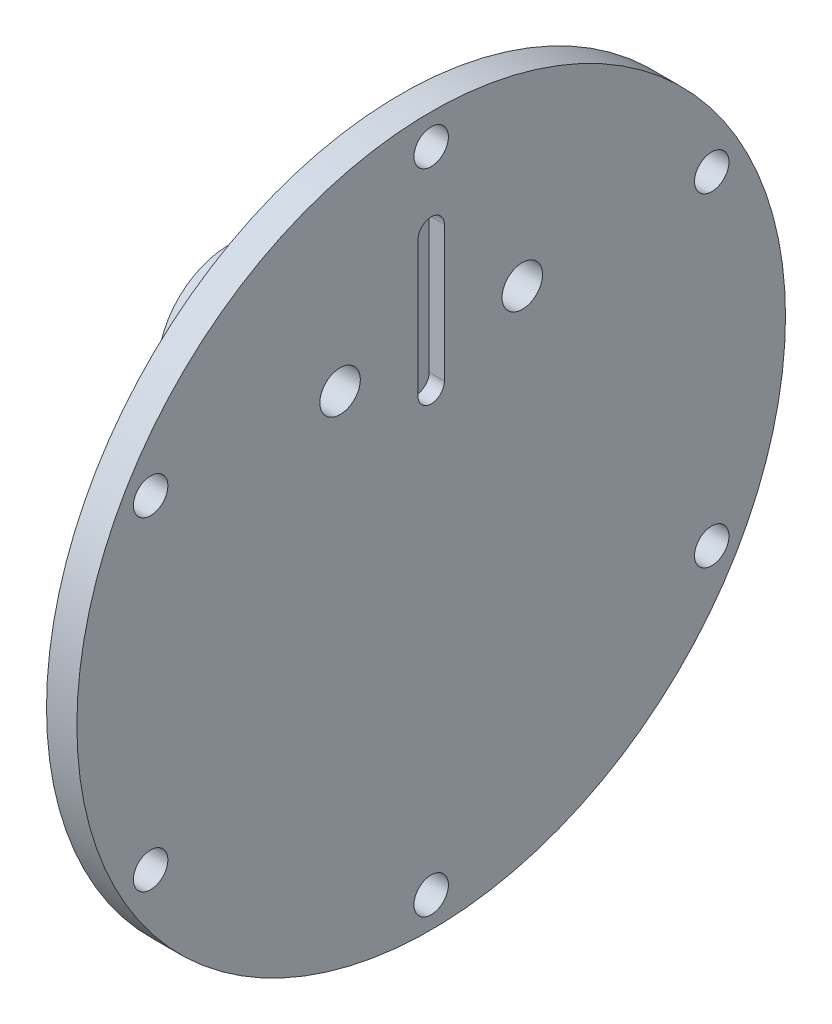
ISO-10303-21;
HEADER;
FILE_DESCRIPTION(('STEP AP214'),'2;1');
FILE_NAME('part.step','',(''),(''),'','','');
FILE_SCHEMA(('AUTOMOTIVE_DESIGN { 1 0 10303 214 1 1 1 1 }'));
ENDSEC;
DATA;
#1=APPLICATION_CONTEXT('core data for automotive mechanical design processes');
#2=APPLICATION_PROTOCOL_DEFINITION('international standard','automotive_design',2000,#1);
#3=PRODUCT_CONTEXT('',#1,'mechanical');
#4=PRODUCT('Part','Part','',(#3));
#5=PRODUCT_RELATED_PRODUCT_CATEGORY('part','',(#4));
#6=PRODUCT_DEFINITION_FORMATION('','',#4);
#7=PRODUCT_DEFINITION_CONTEXT('part definition',#1,'design');
#8=PRODUCT_DEFINITION('design','',#6,#7);
#9=PRODUCT_DEFINITION_SHAPE('','',#8);
#10=(LENGTH_UNIT() NAMED_UNIT(*) SI_UNIT(.MILLI.,.METRE.));
#11=(NAMED_UNIT(*) PLANE_ANGLE_UNIT() SI_UNIT($,.RADIAN.));
#12=(NAMED_UNIT(*) SI_UNIT($,.STERADIAN.) SOLID_ANGLE_UNIT());
#13=UNCERTAINTY_MEASURE_WITH_UNIT(LENGTH_MEASURE(1.E-05),#10,'distance_accuracy_value','');
#14=(GEOMETRIC_REPRESENTATION_CONTEXT(3) GLOBAL_UNCERTAINTY_ASSIGNED_CONTEXT((#13)) GLOBAL_UNIT_ASSIGNED_CONTEXT((#10,
#11,#12)) REPRESENTATION_CONTEXT('',''));
#15=CARTESIAN_POINT('',(0.,0.,0.));
#16=DIRECTION('',(0.,0.,1.));
#17=DIRECTION('',(1.,0.,0.));
#18=AXIS2_PLACEMENT_3D('',#15,#16,#17);
#19=CARTESIAN_POINT('',(0.,0.,0.));
#20=DIRECTION('',(-1.,0.,0.));
#21=DIRECTION('',(0.,0.,1.));
#22=AXIS2_PLACEMENT_3D('',#19,#20,#21);
#23=PLANE('',#22);
#24=CARTESIAN_POINT('',(0.,0.,0.));
#25=DIRECTION('',(-1.,0.,0.));
#26=DIRECTION('',(0.,0.,1.));
#27=AXIS2_PLACEMENT_3D('',#24,#25,#26);
#28=CIRCLE('',#27,35.);
#29=CARTESIAN_POINT('',(0.,0.,35.));
#30=VERTEX_POINT('',#29);
#31=EDGE_CURVE('E176',#30,#30,#28,.T.);
#32=ORIENTED_EDGE('',*,*,#31,.F.);
#33=EDGE_LOOP('',(#32));
#34=FACE_BOUND('',#33,.T.);
#35=CARTESIAN_POINT('',(0.,16.,27.712812921102));
#36=DIRECTION('',(1.,0.,0.));
#37=DIRECTION('',(0.,0.,-1.));
#38=AXIS2_PLACEMENT_3D('',#35,#36,#37);
#39=CIRCLE('',#38,1.7);
#40=CARTESIAN_POINT('',(0.,16.,26.012812921102));
#41=VERTEX_POINT('',#40);
#42=EDGE_CURVE('E139',#41,#41,#39,.T.);
#43=ORIENTED_EDGE('',*,*,#42,.F.);
#44=EDGE_LOOP('',(#43));
#45=FACE_BOUND('',#44,.T.);
#46=CARTESIAN_POINT('',(0.,-16.,27.712812921102));
#47=DIRECTION('',(1.,0.,0.));
#48=DIRECTION('',(0.,0.,-1.));
#49=AXIS2_PLACEMENT_3D('',#46,#47,#48);
#50=CIRCLE('',#49,1.7);
#51=CARTESIAN_POINT('',(0.,-16.,26.012812921102));
#52=VERTEX_POINT('',#51);
#53=EDGE_CURVE('E151',#52,#52,#50,.T.);
#54=ORIENTED_EDGE('',*,*,#53,.F.);
#55=EDGE_LOOP('',(#54));
#56=FACE_BOUND('',#55,.T.);
#57=CARTESIAN_POINT('',(0.,-32.,0.));
#58=DIRECTION('',(1.,0.,0.));
#59=DIRECTION('',(0.,0.,-1.));
#60=AXIS2_PLACEMENT_3D('',#57,#58,#59);
#61=CIRCLE('',#60,1.7);
#62=CARTESIAN_POINT('',(0.,-32.,-1.7));
#63=VERTEX_POINT('',#62);
#64=EDGE_CURVE('E157',#63,#63,#61,.T.);
#65=ORIENTED_EDGE('',*,*,#64,.F.);
#66=EDGE_LOOP('',(#65));
#67=FACE_BOUND('',#66,.T.);
#68=CARTESIAN_POINT('',(0.,-16.,-27.712812921102));
#69=DIRECTION('',(1.,0.,0.));
#70=DIRECTION('',(0.,0.,-1.));
#71=AXIS2_PLACEMENT_3D('',#68,#69,#70);
#72=CIRCLE('',#71,1.7);
#73=CARTESIAN_POINT('',(0.,-16.,-29.412812921102));
#74=VERTEX_POINT('',#73);
#75=EDGE_CURVE('E163',#74,#74,#72,.T.);
#76=ORIENTED_EDGE('',*,*,#75,.F.);
#77=EDGE_LOOP('',(#76));
#78=FACE_BOUND('',#77,.T.);
#79=CARTESIAN_POINT('',(0.,16.,-27.712812921102));
#80=DIRECTION('',(1.,0.,0.));
#81=DIRECTION('',(0.,0.,-1.));
#82=AXIS2_PLACEMENT_3D('',#79,#80,#81);
#83=CIRCLE('',#82,1.7);
#84=CARTESIAN_POINT('',(0.,16.,-29.412812921102));
#85=VERTEX_POINT('',#84);
#86=EDGE_CURVE('E140',#85,#85,#83,.T.);
#87=ORIENTED_EDGE('',*,*,#86,.F.);
#88=EDGE_LOOP('',(#87));
#89=FACE_BOUND('',#88,.T.);
#90=CARTESIAN_POINT('',(0.,32.,0.));
#91=DIRECTION('',(1.,0.,0.));
#92=DIRECTION('',(0.,0.,-1.));
#93=AXIS2_PLACEMENT_3D('',#90,#91,#92);
#94=CIRCLE('',#93,1.7);
#95=CARTESIAN_POINT('',(0.,32.,-1.7));
#96=VERTEX_POINT('',#95);
#97=EDGE_CURVE('E132',#96,#96,#94,.T.);
#98=ORIENTED_EDGE('',*,*,#97,.F.);
#99=EDGE_LOOP('',(#98));
#100=FACE_BOUND('',#99,.T.);
#101=CARTESIAN_POINT('',(0.,15.5884572681199,-9.));
#102=DIRECTION('',(1.,0.,0.));
#103=DIRECTION('',(0.,0.,-1.));
#104=AXIS2_PLACEMENT_3D('',#101,#102,#103);
#105=CIRCLE('',#104,2.);
#106=CARTESIAN_POINT('',(0.,15.5884572681199,-11.));
#107=VERTEX_POINT('',#106);
#108=EDGE_CURVE('E95',#107,#107,#105,.T.);
#109=ORIENTED_EDGE('',*,*,#108,.F.);
#110=EDGE_LOOP('',(#109));
#111=FACE_BOUND('',#110,.T.);
#112=CARTESIAN_POINT('',(0.,15.5884572681199,9.));
#113=DIRECTION('',(1.,0.,0.));
#114=DIRECTION('',(0.,0.,-1.));
#115=AXIS2_PLACEMENT_3D('',#112,#113,#114);
#116=CIRCLE('',#115,2.);
#117=CARTESIAN_POINT('',(0.,15.5884572681199,7.));
#118=VERTEX_POINT('',#117);
#119=EDGE_CURVE('E113',#118,#118,#116,.T.);
#120=ORIENTED_EDGE('',*,*,#119,.F.);
#121=EDGE_LOOP('',(#120));
#122=FACE_BOUND('',#121,.T.);
#123=CARTESIAN_POINT('',(0.,11.3,0.));
#124=DIRECTION('',(1.,0.,0.));
#125=DIRECTION('',(0.,0.,-1.));
#126=AXIS2_PLACEMENT_3D('',#123,#124,#125);
#127=CIRCLE('',#126,1.3);
#128=CARTESIAN_POINT('',(0.,11.3,1.3));
#129=VERTEX_POINT('',#128);
#130=CARTESIAN_POINT('',(0.,11.3,-1.3));
#131=VERTEX_POINT('',#130);
#132=EDGE_CURVE('E80',#129,#131,#127,.T.);
#133=ORIENTED_EDGE('',*,*,#132,.F.);
#134=DIRECTION('',(0.,-1.,0.));
#135=VECTOR('',#134,1.);
#136=CARTESIAN_POINT('',(0.,24.7,1.3));
#137=LINE('',#136,#135);
#138=CARTESIAN_POINT('',(0.,24.7,1.3));
#139=VERTEX_POINT('',#138);
#140=EDGE_CURVE('E56',#139,#129,#137,.T.);
#141=ORIENTED_EDGE('',*,*,#140,.F.);
#142=CARTESIAN_POINT('',(0.,24.7,0.));
#143=DIRECTION('',(1.,0.,0.));
#144=DIRECTION('',(0.,0.,-1.));
#145=AXIS2_PLACEMENT_3D('',#142,#143,#144);
#146=CIRCLE('',#145,1.3);
#147=CARTESIAN_POINT('',(0.,24.7,-1.3));
#148=VERTEX_POINT('',#147);
#149=EDGE_CURVE('E99',#148,#139,#146,.T.);
#150=ORIENTED_EDGE('',*,*,#149,.F.);
#151=DIRECTION('',(0.,1.,0.));
#152=VECTOR('',#151,1.);
#153=CARTESIAN_POINT('',(0.,11.3,-1.3));
#154=LINE('',#153,#152);
#155=EDGE_CURVE('E88',#131,#148,#154,.T.);
#156=ORIENTED_EDGE('',*,*,#155,.F.);
#157=EDGE_LOOP('',(#133,#141,#150,#156));
#158=FACE_BOUND('',#157,.T.);
#159=ADVANCED_FACE('F33',(#34,#45,#56,#67,#78,#89,#100,#111,#122,#158),#23,.F.);
#160=CARTESIAN_POINT('',(-3.,35.,0.));
#161=DIRECTION('',(1.,0.,0.));
#162=DIRECTION('',(0.,0.,-1.));
#163=AXIS2_PLACEMENT_3D('',#160,#161,#162);
#164=PLANE('',#163);
#165=CARTESIAN_POINT('',(-3.,32.,0.));
#166=DIRECTION('',(1.,0.,0.));
#167=DIRECTION('',(0.,0.,-1.));
#168=AXIS2_PLACEMENT_3D('',#165,#166,#167);
#169=CIRCLE('',#168,1.7);
#170=CARTESIAN_POINT('',(-3.,32.,-1.7));
#171=VERTEX_POINT('',#170);
#172=EDGE_CURVE('E136',#171,#171,#169,.T.);
#173=ORIENTED_EDGE('',*,*,#172,.T.);
#174=EDGE_LOOP('',(#173));
#175=FACE_BOUND('',#174,.T.);
#176=CARTESIAN_POINT('',(-3.,16.,-27.712812921102));
#177=DIRECTION('',(1.,0.,0.));
#178=DIRECTION('',(0.,0.,-1.));
#179=AXIS2_PLACEMENT_3D('',#176,#177,#178);
#180=CIRCLE('',#179,1.7);
#181=CARTESIAN_POINT('',(-3.,16.,-29.412812921102));
#182=VERTEX_POINT('',#181);
#183=EDGE_CURVE('E122',#182,#182,#180,.T.);
#184=ORIENTED_EDGE('',*,*,#183,.T.);
#185=EDGE_LOOP('',(#184));
#186=FACE_BOUND('',#185,.T.);
#187=CARTESIAN_POINT('',(-3.,-16.,-27.712812921102));
#188=DIRECTION('',(1.,0.,0.));
#189=DIRECTION('',(0.,0.,-1.));
#190=AXIS2_PLACEMENT_3D('',#187,#188,#189);
#191=CIRCLE('',#190,1.7);
#192=CARTESIAN_POINT('',(-3.,-16.,-29.412812921102));
#193=VERTEX_POINT('',#192);
#194=EDGE_CURVE('E143',#193,#193,#191,.T.);
#195=ORIENTED_EDGE('',*,*,#194,.T.);
#196=EDGE_LOOP('',(#195));
#197=FACE_BOUND('',#196,.T.);
#198=CARTESIAN_POINT('',(-3.,-32.,0.));
#199=DIRECTION('',(1.,0.,0.));
#200=DIRECTION('',(0.,0.,-1.));
#201=AXIS2_PLACEMENT_3D('',#198,#199,#200);
#202=CIRCLE('',#201,1.7);
#203=CARTESIAN_POINT('',(-3.,-32.,-1.7));
#204=VERTEX_POINT('',#203);
#205=EDGE_CURVE('E160',#204,#204,#202,.T.);
#206=ORIENTED_EDGE('',*,*,#205,.T.);
#207=EDGE_LOOP('',(#206));
#208=FACE_BOUND('',#207,.T.);
#209=CARTESIAN_POINT('',(-3.,-16.,27.712812921102));
#210=DIRECTION('',(1.,0.,0.));
#211=DIRECTION('',(0.,0.,-1.));
#212=AXIS2_PLACEMENT_3D('',#209,#210,#211);
#213=CIRCLE('',#212,1.7);
#214=CARTESIAN_POINT('',(-3.,-16.,26.012812921102));
#215=VERTEX_POINT('',#214);
#216=EDGE_CURVE('E154',#215,#215,#213,.T.);
#217=ORIENTED_EDGE('',*,*,#216,.T.);
#218=EDGE_LOOP('',(#217));
#219=FACE_BOUND('',#218,.T.);
#220=CARTESIAN_POINT('',(-3.,16.,27.712812921102));
#221=DIRECTION('',(1.,0.,0.));
#222=DIRECTION('',(0.,0.,-1.));
#223=AXIS2_PLACEMENT_3D('',#220,#221,#222);
#224=CIRCLE('',#223,1.7);
#225=CARTESIAN_POINT('',(-3.,16.,26.012812921102));
#226=VERTEX_POINT('',#225);
#227=EDGE_CURVE('E148',#226,#226,#224,.T.);
#228=ORIENTED_EDGE('',*,*,#227,.T.);
#229=EDGE_LOOP('',(#228));
#230=FACE_BOUND('',#229,.T.);
#231=CARTESIAN_POINT('',(-3.,15.5884572681199,-9.));
#232=DIRECTION('',(1.,0.,0.));
#233=DIRECTION('',(0.,0.,-1.));
#234=AXIS2_PLACEMENT_3D('',#231,#232,#233);
#235=CIRCLE('',#234,7.);
#236=CARTESIAN_POINT('',(-3.,15.5884572681199,-16.));
#237=VERTEX_POINT('',#236);
#238=EDGE_CURVE('E11',#237,#237,#235,.F.);
#239=ORIENTED_EDGE('',*,*,#238,.F.);
#240=EDGE_LOOP('',(#239));
#241=FACE_BOUND('',#240,.T.);
#242=CARTESIAN_POINT('',(-3.,15.5884572681199,9.));
#243=DIRECTION('',(1.,0.,0.));
#244=DIRECTION('',(0.,0.,-1.));
#245=AXIS2_PLACEMENT_3D('',#242,#243,#244);
#246=CIRCLE('',#245,7.);
#247=CARTESIAN_POINT('',(-3.,15.5884572681199,2.));
#248=VERTEX_POINT('',#247);
#249=EDGE_CURVE('E42',#248,#248,#246,.F.);
#250=ORIENTED_EDGE('',*,*,#249,.F.);
#251=EDGE_LOOP('',(#250));
#252=FACE_BOUND('',#251,.T.);
#253=CARTESIAN_POINT('',(-3.,0.,0.));
#254=DIRECTION('',(-1.,0.,0.));
#255=DIRECTION('',(0.,0.,1.));
#256=AXIS2_PLACEMENT_3D('',#253,#254,#255);
#257=CIRCLE('',#256,35.);
#258=CARTESIAN_POINT('',(-3.,0.,35.));
#259=VERTEX_POINT('',#258);
#260=EDGE_CURVE('E173',#259,#259,#257,.T.);
#261=ORIENTED_EDGE('',*,*,#260,.T.);
#262=EDGE_LOOP('',(#261));
#263=FACE_BOUND('',#262,.T.);
#264=ADVANCED_FACE('F35',(#175,#186,#197,#208,#219,#230,#241,#252,#263),#164,.F.);
#265=CARTESIAN_POINT('',(-30.,0.,0.));
#266=DIRECTION('',(-1.,0.,0.));
#267=DIRECTION('',(0.,0.,1.));
#268=AXIS2_PLACEMENT_3D('',#265,#266,#267);
#269=CYLINDRICAL_SURFACE('',#268,35.);
#270=ORIENTED_EDGE('',*,*,#260,.F.);
#271=EDGE_LOOP('',(#270));
#272=FACE_BOUND('',#271,.T.);
#273=ORIENTED_EDGE('',*,*,#31,.T.);
#274=EDGE_LOOP('',(#273));
#275=FACE_BOUND('',#274,.T.);
#276=ADVANCED_FACE('F225',(#272,#275),#269,.T.);
#277=CARTESIAN_POINT('',(-3.,15.5884572681199,9.));
#278=DIRECTION('',(-1.,0.,0.));
#279=DIRECTION('',(0.,0.,1.));
#280=AXIS2_PLACEMENT_3D('',#277,#278,#279);
#281=CYLINDRICAL_SURFACE('',#280,7.);
#282=ORIENTED_EDGE('',*,*,#249,.T.);
#283=EDGE_LOOP('',(#282));
#284=FACE_BOUND('',#283,.T.);
#285=CARTESIAN_POINT('',(-11.,15.5884572681199,9.));
#286=DIRECTION('',(1.,0.,0.));
#287=DIRECTION('',(0.,0.,-1.));
#288=AXIS2_PLACEMENT_3D('',#285,#286,#287);
#289=CIRCLE('',#288,7.);
#290=CARTESIAN_POINT('',(-11.,15.5884572681199,2.));
#291=VERTEX_POINT('',#290);
#292=EDGE_CURVE('E170',#291,#291,#289,.T.);
#293=ORIENTED_EDGE('',*,*,#292,.T.);
#294=EDGE_LOOP('',(#293));
#295=FACE_BOUND('',#294,.T.);
#296=ADVANCED_FACE('F217',(#284,#295),#281,.T.);
#297=CARTESIAN_POINT('',(-11.,15.5884572681199,9.));
#298=DIRECTION('',(1.,0.,0.));
#299=DIRECTION('',(0.,0.,-1.));
#300=AXIS2_PLACEMENT_3D('',#297,#298,#299);
#301=PLANE('',#300);
#302=CARTESIAN_POINT('',(-11.,15.5884572681199,9.));
#303=DIRECTION('',(1.,0.,0.));
#304=DIRECTION('',(0.,0.,-1.));
#305=AXIS2_PLACEMENT_3D('',#302,#303,#304);
#306=CIRCLE('',#305,4.4);
#307=CARTESIAN_POINT('',(-11.,15.5884572681199,4.6));
#308=VERTEX_POINT('',#307);
#309=EDGE_CURVE('E123',#308,#308,#306,.T.);
#310=ORIENTED_EDGE('',*,*,#309,.T.);
#311=EDGE_LOOP('',(#310));
#312=FACE_BOUND('',#311,.T.);
#313=ORIENTED_EDGE('',*,*,#292,.F.);
#314=EDGE_LOOP('',(#313));
#315=FACE_BOUND('',#314,.T.);
#316=ADVANCED_FACE('F211',(#312,#315),#301,.F.);
#317=CARTESIAN_POINT('',(-3.,15.5884572681199,-9.));
#318=DIRECTION('',(-1.,0.,0.));
#319=DIRECTION('',(0.,0.,1.));
#320=AXIS2_PLACEMENT_3D('',#317,#318,#319);
#321=CYLINDRICAL_SURFACE('',#320,7.);
#322=ORIENTED_EDGE('',*,*,#238,.T.);
#323=EDGE_LOOP('',(#322));
#324=FACE_BOUND('',#323,.T.);
#325=CARTESIAN_POINT('',(-11.,15.5884572681199,-9.));
#326=DIRECTION('',(1.,0.,0.));
#327=DIRECTION('',(0.,0.,-1.));
#328=AXIS2_PLACEMENT_3D('',#325,#326,#327);
#329=CIRCLE('',#328,7.);
#330=CARTESIAN_POINT('',(-11.,15.5884572681199,-16.));
#331=VERTEX_POINT('',#330);
#332=EDGE_CURVE('E135',#331,#331,#329,.T.);
#333=ORIENTED_EDGE('',*,*,#332,.T.);
#334=EDGE_LOOP('',(#333));
#335=FACE_BOUND('',#334,.T.);
#336=ADVANCED_FACE('F206',(#324,#335),#321,.T.);
#337=CARTESIAN_POINT('',(-11.,15.5884572681199,-9.));
#338=DIRECTION('',(1.,0.,0.));
#339=DIRECTION('',(0.,0.,-1.));
#340=AXIS2_PLACEMENT_3D('',#337,#338,#339);
#341=PLANE('',#340);
#342=CARTESIAN_POINT('',(-11.,15.5884572681199,-9.));
#343=DIRECTION('',(1.,0.,0.));
#344=DIRECTION('',(0.,0.,-1.));
#345=AXIS2_PLACEMENT_3D('',#342,#343,#344);
#346=CIRCLE('',#345,4.4);
#347=CARTESIAN_POINT('',(-11.,15.5884572681199,-13.4));
#348=VERTEX_POINT('',#347);
#349=EDGE_CURVE('E129',#348,#348,#346,.T.);
#350=ORIENTED_EDGE('',*,*,#349,.T.);
#351=EDGE_LOOP('',(#350));
#352=FACE_BOUND('',#351,.T.);
#353=ORIENTED_EDGE('',*,*,#332,.F.);
#354=EDGE_LOOP('',(#353));
#355=FACE_BOUND('',#354,.T.);
#356=ADVANCED_FACE('F202',(#352,#355),#341,.F.);
#357=CARTESIAN_POINT('',(0.,16.,27.712812921102));
#358=DIRECTION('',(-1.,0.,0.));
#359=DIRECTION('',(0.,0.,1.));
#360=AXIS2_PLACEMENT_3D('',#357,#358,#359);
#361=CYLINDRICAL_SURFACE('',#360,1.7);
#362=ORIENTED_EDGE('',*,*,#42,.T.);
#363=EDGE_LOOP('',(#362));
#364=FACE_BOUND('',#363,.T.);
#365=ORIENTED_EDGE('',*,*,#227,.F.);
#366=EDGE_LOOP('',(#365));
#367=FACE_BOUND('',#366,.T.);
#368=ADVANCED_FACE('F205',(#364,#367),#361,.F.);
#369=CARTESIAN_POINT('',(0.,-16.,27.712812921102));
#370=DIRECTION('',(-1.,0.,0.));
#371=DIRECTION('',(0.,0.,1.));
#372=AXIS2_PLACEMENT_3D('',#369,#370,#371);
#373=CYLINDRICAL_SURFACE('',#372,1.7);
#374=ORIENTED_EDGE('',*,*,#53,.T.);
#375=EDGE_LOOP('',(#374));
#376=FACE_BOUND('',#375,.T.);
#377=ORIENTED_EDGE('',*,*,#216,.F.);
#378=EDGE_LOOP('',(#377));
#379=FACE_BOUND('',#378,.T.);
#380=ADVANCED_FACE('F376',(#376,#379),#373,.F.);
#381=CARTESIAN_POINT('',(0.,-32.,0.));
#382=DIRECTION('',(-1.,0.,0.));
#383=DIRECTION('',(0.,0.,1.));
#384=AXIS2_PLACEMENT_3D('',#381,#382,#383);
#385=CYLINDRICAL_SURFACE('',#384,1.7);
#386=ORIENTED_EDGE('',*,*,#64,.T.);
#387=EDGE_LOOP('',(#386));
#388=FACE_BOUND('',#387,.T.);
#389=ORIENTED_EDGE('',*,*,#205,.F.);
#390=EDGE_LOOP('',(#389));
#391=FACE_BOUND('',#390,.T.);
#392=ADVANCED_FACE('F380',(#388,#391),#385,.F.);
#393=CARTESIAN_POINT('',(0.,-16.,-27.712812921102));
#394=DIRECTION('',(-1.,0.,0.));
#395=DIRECTION('',(0.,0.,1.));
#396=AXIS2_PLACEMENT_3D('',#393,#394,#395);
#397=CYLINDRICAL_SURFACE('',#396,1.7);
#398=ORIENTED_EDGE('',*,*,#75,.T.);
#399=EDGE_LOOP('',(#398));
#400=FACE_BOUND('',#399,.T.);
#401=ORIENTED_EDGE('',*,*,#194,.F.);
#402=EDGE_LOOP('',(#401));
#403=FACE_BOUND('',#402,.T.);
#404=ADVANCED_FACE('F373',(#400,#403),#397,.F.);
#405=CARTESIAN_POINT('',(0.,16.,-27.712812921102));
#406=DIRECTION('',(-1.,0.,0.));
#407=DIRECTION('',(0.,0.,1.));
#408=AXIS2_PLACEMENT_3D('',#405,#406,#407);
#409=CYLINDRICAL_SURFACE('',#408,1.7);
#410=ORIENTED_EDGE('',*,*,#86,.T.);
#411=EDGE_LOOP('',(#410));
#412=FACE_BOUND('',#411,.T.);
#413=ORIENTED_EDGE('',*,*,#183,.F.);
#414=EDGE_LOOP('',(#413));
#415=FACE_BOUND('',#414,.T.);
#416=ADVANCED_FACE('F369',(#412,#415),#409,.F.);
#417=CARTESIAN_POINT('',(0.,32.,0.));
#418=DIRECTION('',(-1.,0.,0.));
#419=DIRECTION('',(0.,0.,1.));
#420=AXIS2_PLACEMENT_3D('',#417,#418,#419);
#421=CYLINDRICAL_SURFACE('',#420,1.7);
#422=ORIENTED_EDGE('',*,*,#97,.T.);
#423=EDGE_LOOP('',(#422));
#424=FACE_BOUND('',#423,.T.);
#425=ORIENTED_EDGE('',*,*,#172,.F.);
#426=EDGE_LOOP('',(#425));
#427=FACE_BOUND('',#426,.T.);
#428=ADVANCED_FACE('F198',(#424,#427),#421,.F.);
#429=CARTESIAN_POINT('',(-4.,15.5884572681199,-9.));
#430=DIRECTION('',(-1.,0.,0.));
#431=DIRECTION('',(0.,0.,1.));
#432=AXIS2_PLACEMENT_3D('',#429,#430,#431);
#433=CYLINDRICAL_SURFACE('',#432,4.4);
#434=CARTESIAN_POINT('',(-4.,15.5884572681199,-9.));
#435=DIRECTION('',(1.,0.,0.));
#436=DIRECTION('',(0.,0.,-1.));
#437=AXIS2_PLACEMENT_3D('',#434,#435,#436);
#438=CIRCLE('',#437,4.4);
#439=CARTESIAN_POINT('',(-4.,15.5884572681199,-13.4));
#440=VERTEX_POINT('',#439);
#441=EDGE_CURVE('E126',#440,#440,#438,.T.);
#442=ORIENTED_EDGE('',*,*,#441,.T.);
#443=EDGE_LOOP('',(#442));
#444=FACE_BOUND('',#443,.T.);
#445=ORIENTED_EDGE('',*,*,#349,.F.);
#446=EDGE_LOOP('',(#445));
#447=FACE_BOUND('',#446,.T.);
#448=ADVANCED_FACE('F192',(#444,#447),#433,.F.);
#449=CARTESIAN_POINT('',(-4.,15.5884572681199,-9.));
#450=DIRECTION('',(1.,0.,0.));
#451=DIRECTION('',(0.,0.,-1.));
#452=AXIS2_PLACEMENT_3D('',#449,#450,#451);
#453=PLANE('',#452);
#454=CARTESIAN_POINT('',(-4.,15.5884572681199,-9.));
#455=DIRECTION('',(1.,0.,0.));
#456=DIRECTION('',(0.,0.,-1.));
#457=AXIS2_PLACEMENT_3D('',#454,#455,#456);
#458=CIRCLE('',#457,2.);
#459=CARTESIAN_POINT('',(-4.,15.5884572681199,-11.));
#460=VERTEX_POINT('',#459);
#461=EDGE_CURVE('E37',#460,#460,#458,.F.);
#462=ORIENTED_EDGE('',*,*,#461,.F.);
#463=EDGE_LOOP('',(#462));
#464=FACE_BOUND('',#463,.T.);
#465=ORIENTED_EDGE('',*,*,#441,.F.);
#466=EDGE_LOOP('',(#465));
#467=FACE_BOUND('',#466,.T.);
#468=ADVANCED_FACE('F188',(#464,#467),#453,.F.);
#469=CARTESIAN_POINT('',(-4.,15.5884572681199,9.));
#470=DIRECTION('',(-1.,0.,0.));
#471=DIRECTION('',(0.,0.,1.));
#472=AXIS2_PLACEMENT_3D('',#469,#470,#471);
#473=CYLINDRICAL_SURFACE('',#472,4.4);
#474=CARTESIAN_POINT('',(-4.,15.5884572681199,9.));
#475=DIRECTION('',(1.,0.,0.));
#476=DIRECTION('',(0.,0.,-1.));
#477=AXIS2_PLACEMENT_3D('',#474,#475,#476);
#478=CIRCLE('',#477,4.4);
#479=CARTESIAN_POINT('',(-4.,15.5884572681199,4.6));
#480=VERTEX_POINT('',#479);
#481=EDGE_CURVE('E119',#480,#480,#478,.T.);
#482=ORIENTED_EDGE('',*,*,#481,.T.);
#483=EDGE_LOOP('',(#482));
#484=FACE_BOUND('',#483,.T.);
#485=ORIENTED_EDGE('',*,*,#309,.F.);
#486=EDGE_LOOP('',(#485));
#487=FACE_BOUND('',#486,.T.);
#488=ADVANCED_FACE('F191',(#484,#487),#473,.F.);
#489=CARTESIAN_POINT('',(-4.,15.5884572681199,9.));
#490=DIRECTION('',(1.,0.,0.));
#491=DIRECTION('',(0.,0.,-1.));
#492=AXIS2_PLACEMENT_3D('',#489,#490,#491);
#493=PLANE('',#492);
#494=CARTESIAN_POINT('',(-4.,15.5884572681199,9.));
#495=DIRECTION('',(1.,0.,0.));
#496=DIRECTION('',(0.,0.,-1.));
#497=AXIS2_PLACEMENT_3D('',#494,#495,#496);
#498=CIRCLE('',#497,2.);
#499=CARTESIAN_POINT('',(-4.,15.5884572681199,7.));
#500=VERTEX_POINT('',#499);
#501=EDGE_CURVE('E116',#500,#500,#498,.F.);
#502=ORIENTED_EDGE('',*,*,#501,.F.);
#503=EDGE_LOOP('',(#502));
#504=FACE_BOUND('',#503,.T.);
#505=ORIENTED_EDGE('',*,*,#481,.F.);
#506=EDGE_LOOP('',(#505));
#507=FACE_BOUND('',#506,.T.);
#508=ADVANCED_FACE('F281',(#504,#507),#493,.F.);
#509=CARTESIAN_POINT('',(0.,15.5884572681199,9.));
#510=DIRECTION('',(-1.,0.,0.));
#511=DIRECTION('',(0.,0.,1.));
#512=AXIS2_PLACEMENT_3D('',#509,#510,#511);
#513=CYLINDRICAL_SURFACE('',#512,2.);
#514=ORIENTED_EDGE('',*,*,#119,.T.);
#515=EDGE_LOOP('',(#514));
#516=FACE_BOUND('',#515,.T.);
#517=ORIENTED_EDGE('',*,*,#501,.T.);
#518=EDGE_LOOP('',(#517));
#519=FACE_BOUND('',#518,.T.);
#520=ADVANCED_FACE('F296',(#516,#519),#513,.F.);
#521=CARTESIAN_POINT('',(0.,15.5884572681199,-9.));
#522=DIRECTION('',(-1.,0.,0.));
#523=DIRECTION('',(0.,0.,1.));
#524=AXIS2_PLACEMENT_3D('',#521,#522,#523);
#525=CYLINDRICAL_SURFACE('',#524,2.);
#526=ORIENTED_EDGE('',*,*,#108,.T.);
#527=EDGE_LOOP('',(#526));
#528=FACE_BOUND('',#527,.T.);
#529=ORIENTED_EDGE('',*,*,#461,.T.);
#530=EDGE_LOOP('',(#529));
#531=FACE_BOUND('',#530,.T.);
#532=ADVANCED_FACE('F186',(#528,#531),#525,.F.);
#533=CARTESIAN_POINT('',(0.,11.3,0.));
#534=DIRECTION('',(-1.,0.,0.));
#535=DIRECTION('',(0.,0.,1.));
#536=AXIS2_PLACEMENT_3D('',#533,#534,#535);
#537=CYLINDRICAL_SURFACE('',#536,1.3);
#538=CARTESIAN_POINT('',(-1.5,11.3,0.));
#539=DIRECTION('',(1.,0.,0.));
#540=DIRECTION('',(0.,0.,-1.));
#541=AXIS2_PLACEMENT_3D('',#538,#539,#540);
#542=CIRCLE('',#541,1.3);
#543=CARTESIAN_POINT('',(-1.5,11.3,1.3));
#544=VERTEX_POINT('',#543);
#545=CARTESIAN_POINT('',(-1.5,11.3,-1.3));
#546=VERTEX_POINT('',#545);
#547=EDGE_CURVE('E104',#544,#546,#542,.T.);
#548=ORIENTED_EDGE('',*,*,#547,.F.);
#549=DIRECTION('',(-1.,0.,0.));
#550=VECTOR('',#549,1.);
#551=CARTESIAN_POINT('',(0.,11.3,1.3));
#552=LINE('',#551,#550);
#553=EDGE_CURVE('E85',#129,#544,#552,.T.);
#554=ORIENTED_EDGE('',*,*,#553,.F.);
#555=ORIENTED_EDGE('',*,*,#132,.T.);
#556=DIRECTION('',(-1.,0.,0.));
#557=VECTOR('',#556,1.);
#558=CARTESIAN_POINT('',(0.,11.3,-1.3));
#559=LINE('',#558,#557);
#560=EDGE_CURVE('E84',#131,#546,#559,.T.);
#561=ORIENTED_EDGE('',*,*,#560,.T.);
#562=EDGE_LOOP('',(#548,#554,#555,#561));
#563=FACE_BOUND('',#562,.T.);
#564=ADVANCED_FACE('F83',(#563),#537,.F.);
#565=CARTESIAN_POINT('',(0.,11.3,-1.3));
#566=DIRECTION('',(0.,0.,1.));
#567=DIRECTION('',(1.,0.,0.));
#568=AXIS2_PLACEMENT_3D('',#565,#566,#567);
#569=PLANE('',#568);
#570=DIRECTION('',(0.,1.,0.));
#571=VECTOR('',#570,1.);
#572=CARTESIAN_POINT('',(-1.5,11.3,-1.3));
#573=LINE('',#572,#571);
#574=CARTESIAN_POINT('',(-1.5,24.7,-1.3));
#575=VERTEX_POINT('',#574);
#576=EDGE_CURVE('E94',#546,#575,#573,.T.);
#577=ORIENTED_EDGE('',*,*,#576,.F.);
#578=ORIENTED_EDGE('',*,*,#560,.F.);
#579=ORIENTED_EDGE('',*,*,#155,.T.);
#580=DIRECTION('',(-1.,0.,0.));
#581=VECTOR('',#580,1.);
#582=CARTESIAN_POINT('',(0.,24.7,-1.3));
#583=LINE('',#582,#581);
#584=EDGE_CURVE('E96',#148,#575,#583,.T.);
#585=ORIENTED_EDGE('',*,*,#584,.T.);
#586=EDGE_LOOP('',(#577,#578,#579,#585));
#587=FACE_BOUND('',#586,.T.);
#588=ADVANCED_FACE('F91',(#587),#569,.T.);
#589=CARTESIAN_POINT('',(0.,24.7,0.));
#590=DIRECTION('',(-1.,0.,0.));
#591=DIRECTION('',(0.,0.,1.));
#592=AXIS2_PLACEMENT_3D('',#589,#590,#591);
#593=CYLINDRICAL_SURFACE('',#592,1.3);
#594=CARTESIAN_POINT('',(-1.5,24.7,0.));
#595=DIRECTION('',(1.,0.,0.));
#596=DIRECTION('',(0.,0.,-1.));
#597=AXIS2_PLACEMENT_3D('',#594,#595,#596);
#598=CIRCLE('',#597,1.3);
#599=CARTESIAN_POINT('',(-1.5,24.7,1.3));
#600=VERTEX_POINT('',#599);
#601=EDGE_CURVE('E107',#575,#600,#598,.T.);
#602=ORIENTED_EDGE('',*,*,#601,.F.);
#603=ORIENTED_EDGE('',*,*,#584,.F.);
#604=ORIENTED_EDGE('',*,*,#149,.T.);
#605=DIRECTION('',(-1.,0.,0.));
#606=VECTOR('',#605,1.);
#607=CARTESIAN_POINT('',(0.,24.7,1.3));
#608=LINE('',#607,#606);
#609=EDGE_CURVE('E50',#139,#600,#608,.T.);
#610=ORIENTED_EDGE('',*,*,#609,.T.);
#611=EDGE_LOOP('',(#602,#603,#604,#610));
#612=FACE_BOUND('',#611,.T.);
#613=ADVANCED_FACE('F336',(#612),#593,.F.);
#614=CARTESIAN_POINT('',(0.,24.7,1.3));
#615=DIRECTION('',(0.,0.,-1.));
#616=DIRECTION('',(-1.,0.,0.));
#617=AXIS2_PLACEMENT_3D('',#614,#615,#616);
#618=PLANE('',#617);
#619=DIRECTION('',(0.,-1.,0.));
#620=VECTOR('',#619,1.);
#621=CARTESIAN_POINT('',(-1.5,24.7,1.3));
#622=LINE('',#621,#620);
#623=EDGE_CURVE('E75',#600,#544,#622,.T.);
#624=ORIENTED_EDGE('',*,*,#623,.F.);
#625=ORIENTED_EDGE('',*,*,#609,.F.);
#626=ORIENTED_EDGE('',*,*,#140,.T.);
#627=ORIENTED_EDGE('',*,*,#553,.T.);
#628=EDGE_LOOP('',(#624,#625,#626,#627));
#629=FACE_BOUND('',#628,.T.);
#630=ADVANCED_FACE('F345',(#629),#618,.T.);
#631=CARTESIAN_POINT('',(-1.5,11.3,0.));
#632=DIRECTION('',(1.,0.,0.));
#633=DIRECTION('',(0.,0.,-1.));
#634=AXIS2_PLACEMENT_3D('',#631,#632,#633);
#635=PLANE('',#634);
#636=ORIENTED_EDGE('',*,*,#547,.T.);
#637=ORIENTED_EDGE('',*,*,#576,.T.);
#638=ORIENTED_EDGE('',*,*,#601,.T.);
#639=ORIENTED_EDGE('',*,*,#623,.T.);
#640=EDGE_LOOP('',(#636,#637,#638,#639));
#641=FACE_BOUND('',#640,.T.);
#642=ADVANCED_FACE('F355',(#641),#635,.T.);
#643=CLOSED_SHELL('',(#159,#264,#276,#296,#316,#336,#356,#368,#380,#392,#404,#416,#428,#448,
#468,#488,#508,#520,#532,#564,#588,#613,#630,#642));
#644=MANIFOLD_SOLID_BREP('B2',#643);
#645=ADVANCED_BREP_SHAPE_REPRESENTATION('',(#18,#644),#14);
#646=SHAPE_DEFINITION_REPRESENTATION(#9,#645);
ENDSEC;
END-ISO-10303-21;
